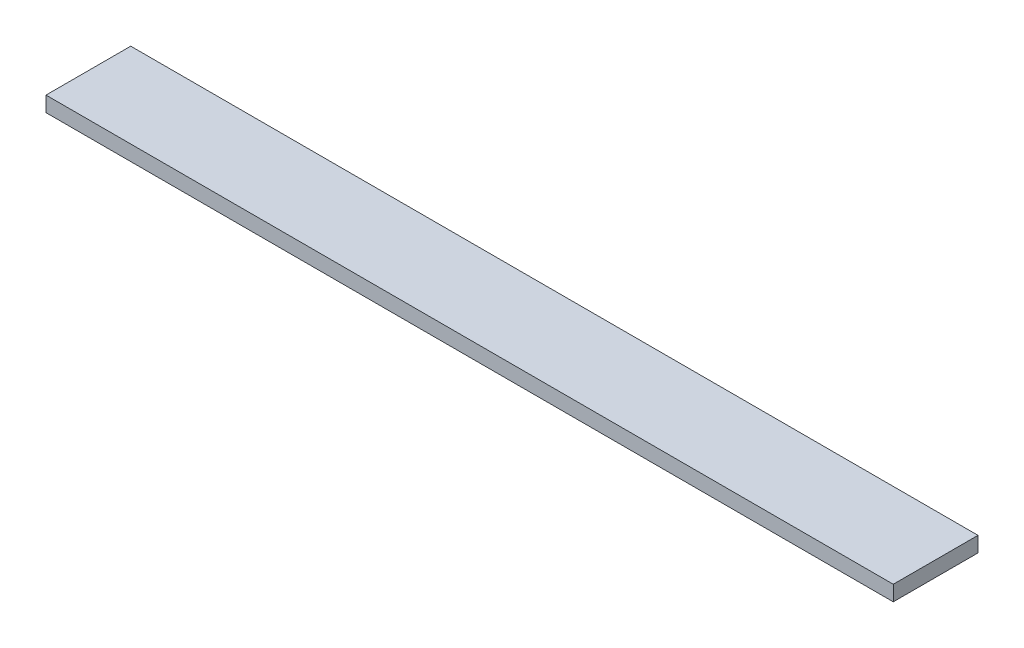
ISO-10303-21;
HEADER;
FILE_DESCRIPTION(('STEP AP214'),'2;1');
FILE_NAME('part.step','',(''),(''),'','','');
FILE_SCHEMA(('AUTOMOTIVE_DESIGN { 1 0 10303 214 1 1 1 1 }'));
ENDSEC;
DATA;
#1=APPLICATION_CONTEXT('core data for automotive mechanical design processes');
#2=APPLICATION_PROTOCOL_DEFINITION('international standard','automotive_design',2000,#1);
#3=PRODUCT_CONTEXT('',#1,'mechanical');
#4=PRODUCT('Part','Part','',(#3));
#5=PRODUCT_RELATED_PRODUCT_CATEGORY('part','',(#4));
#6=PRODUCT_DEFINITION_FORMATION('','',#4);
#7=PRODUCT_DEFINITION_CONTEXT('part definition',#1,'design');
#8=PRODUCT_DEFINITION('design','',#6,#7);
#9=PRODUCT_DEFINITION_SHAPE('','',#8);
#10=(LENGTH_UNIT() NAMED_UNIT(*) SI_UNIT(.MILLI.,.METRE.));
#11=(NAMED_UNIT(*) PLANE_ANGLE_UNIT() SI_UNIT($,.RADIAN.));
#12=(NAMED_UNIT(*) SI_UNIT($,.STERADIAN.) SOLID_ANGLE_UNIT());
#13=UNCERTAINTY_MEASURE_WITH_UNIT(LENGTH_MEASURE(1.E-05),#10,'distance_accuracy_value','');
#14=(GEOMETRIC_REPRESENTATION_CONTEXT(3) GLOBAL_UNCERTAINTY_ASSIGNED_CONTEXT((#13)) GLOBAL_UNIT_ASSIGNED_CONTEXT((#10,
#11,#12)) REPRESENTATION_CONTEXT('',''));
#15=CARTESIAN_POINT('',(0.,0.,0.));
#16=DIRECTION('',(0.,0.,1.));
#17=DIRECTION('',(1.,0.,0.));
#18=AXIS2_PLACEMENT_3D('',#15,#16,#17);
#19=CARTESIAN_POINT('',(500.,18.,-50.));
#20=DIRECTION('',(-1.,0.,0.));
#21=DIRECTION('',(0.,0.,1.));
#22=AXIS2_PLACEMENT_3D('',#19,#20,#21);
#23=PLANE('',#22);
#24=DIRECTION('',(0.,0.,-1.));
#25=VECTOR('',#24,1.);
#26=CARTESIAN_POINT('',(500.,0.,-50.));
#27=LINE('',#26,#25);
#28=CARTESIAN_POINT('',(500.,0.,50.));
#29=VERTEX_POINT('',#28);
#30=CARTESIAN_POINT('',(500.,0.,-50.));
#31=VERTEX_POINT('',#30);
#32=EDGE_CURVE('E96',#29,#31,#27,.T.);
#33=ORIENTED_EDGE('',*,*,#32,.T.);
#34=DIRECTION('',(0.,-1.,0.));
#35=VECTOR('',#34,1.);
#36=CARTESIAN_POINT('',(500.,18.,-50.));
#37=LINE('',#36,#35);
#38=CARTESIAN_POINT('',(500.,18.,-50.));
#39=VERTEX_POINT('',#38);
#40=EDGE_CURVE('E11',#39,#31,#37,.T.);
#41=ORIENTED_EDGE('',*,*,#40,.F.);
#42=DIRECTION('',(0.,0.,-1.));
#43=VECTOR('',#42,1.);
#44=CARTESIAN_POINT('',(500.,18.,-50.));
#45=LINE('',#44,#43);
#46=CARTESIAN_POINT('',(500.,18.,50.));
#47=VERTEX_POINT('',#46);
#48=EDGE_CURVE('E84',#47,#39,#45,.T.);
#49=ORIENTED_EDGE('',*,*,#48,.F.);
#50=DIRECTION('',(0.,-1.,0.));
#51=VECTOR('',#50,1.);
#52=CARTESIAN_POINT('',(500.,18.,50.));
#53=LINE('',#52,#51);
#54=EDGE_CURVE('E92',#47,#29,#53,.T.);
#55=ORIENTED_EDGE('',*,*,#54,.T.);
#56=EDGE_LOOP('',(#33,#41,#49,#55));
#57=FACE_BOUND('',#56,.T.);
#58=ADVANCED_FACE('F33',(#57),#23,.F.);
#59=CARTESIAN_POINT('',(-500.,18.,-50.));
#60=DIRECTION('',(0.,0.,1.));
#61=DIRECTION('',(1.,0.,0.));
#62=AXIS2_PLACEMENT_3D('',#59,#60,#61);
#63=PLANE('',#62);
#64=DIRECTION('',(-1.,0.,0.));
#65=VECTOR('',#64,1.);
#66=CARTESIAN_POINT('',(-500.,0.,-50.));
#67=LINE('',#66,#65);
#68=CARTESIAN_POINT('',(-500.,0.,-50.));
#69=VERTEX_POINT('',#68);
#70=EDGE_CURVE('E88',#31,#69,#67,.T.);
#71=ORIENTED_EDGE('',*,*,#70,.T.);
#72=DIRECTION('',(0.,-1.,0.));
#73=VECTOR('',#72,1.);
#74=CARTESIAN_POINT('',(-500.,18.,-50.));
#75=LINE('',#74,#73);
#76=CARTESIAN_POINT('',(-500.,18.,-50.));
#77=VERTEX_POINT('',#76);
#78=EDGE_CURVE('E41',#77,#69,#75,.T.);
#79=ORIENTED_EDGE('',*,*,#78,.F.);
#80=DIRECTION('',(-1.,0.,0.));
#81=VECTOR('',#80,1.);
#82=CARTESIAN_POINT('',(-500.,18.,-50.));
#83=LINE('',#82,#81);
#84=EDGE_CURVE('E79',#39,#77,#83,.T.);
#85=ORIENTED_EDGE('',*,*,#84,.F.);
#86=ORIENTED_EDGE('',*,*,#40,.T.);
#87=EDGE_LOOP('',(#71,#79,#85,#86));
#88=FACE_BOUND('',#87,.T.);
#89=ADVANCED_FACE('F87',(#88),#63,.F.);
#90=CARTESIAN_POINT('',(-500.,18.,-50.));
#91=DIRECTION('',(1.,0.,0.));
#92=DIRECTION('',(0.,0.,-1.));
#93=AXIS2_PLACEMENT_3D('',#90,#91,#92);
#94=PLANE('',#93);
#95=DIRECTION('',(0.,0.,1.));
#96=VECTOR('',#95,1.);
#97=CARTESIAN_POINT('',(-500.,0.,-50.));
#98=LINE('',#97,#96);
#99=CARTESIAN_POINT('',(-500.,0.,50.));
#100=VERTEX_POINT('',#99);
#101=EDGE_CURVE('E66',#69,#100,#98,.T.);
#102=ORIENTED_EDGE('',*,*,#101,.T.);
#103=DIRECTION('',(0.,-1.,0.));
#104=VECTOR('',#103,1.);
#105=CARTESIAN_POINT('',(-500.,18.,50.));
#106=LINE('',#105,#104);
#107=CARTESIAN_POINT('',(-500.,18.,50.));
#108=VERTEX_POINT('',#107);
#109=EDGE_CURVE('E89',#108,#100,#106,.T.);
#110=ORIENTED_EDGE('',*,*,#109,.F.);
#111=DIRECTION('',(0.,0.,1.));
#112=VECTOR('',#111,1.);
#113=CARTESIAN_POINT('',(-500.,18.,-50.));
#114=LINE('',#113,#112);
#115=EDGE_CURVE('E82',#77,#108,#114,.T.);
#116=ORIENTED_EDGE('',*,*,#115,.F.);
#117=ORIENTED_EDGE('',*,*,#78,.T.);
#118=EDGE_LOOP('',(#102,#110,#116,#117));
#119=FACE_BOUND('',#118,.T.);
#120=ADVANCED_FACE('F90',(#119),#94,.F.);
#121=CARTESIAN_POINT('',(-500.,18.,50.));
#122=DIRECTION('',(0.,0.,-1.));
#123=DIRECTION('',(-1.,0.,0.));
#124=AXIS2_PLACEMENT_3D('',#121,#122,#123);
#125=PLANE('',#124);
#126=DIRECTION('',(1.,0.,0.));
#127=VECTOR('',#126,1.);
#128=CARTESIAN_POINT('',(-500.,0.,50.));
#129=LINE('',#128,#127);
#130=EDGE_CURVE('E72',#100,#29,#129,.T.);
#131=ORIENTED_EDGE('',*,*,#130,.T.);
#132=ORIENTED_EDGE('',*,*,#54,.F.);
#133=DIRECTION('',(1.,0.,0.));
#134=VECTOR('',#133,1.);
#135=CARTESIAN_POINT('',(-500.,18.,50.));
#136=LINE('',#135,#134);
#137=EDGE_CURVE('E49',#108,#47,#136,.T.);
#138=ORIENTED_EDGE('',*,*,#137,.F.);
#139=ORIENTED_EDGE('',*,*,#109,.T.);
#140=EDGE_LOOP('',(#131,#132,#138,#139));
#141=FACE_BOUND('',#140,.T.);
#142=ADVANCED_FACE('F103',(#141),#125,.F.);
#143=CARTESIAN_POINT('',(0.,18.,0.));
#144=DIRECTION('',(0.,1.,0.));
#145=DIRECTION('',(0.,0.,1.));
#146=AXIS2_PLACEMENT_3D('',#143,#144,#145);
#147=PLANE('',#146);
#148=ORIENTED_EDGE('',*,*,#48,.T.);
#149=ORIENTED_EDGE('',*,*,#84,.T.);
#150=ORIENTED_EDGE('',*,*,#115,.T.);
#151=ORIENTED_EDGE('',*,*,#137,.T.);
#152=EDGE_LOOP('',(#148,#149,#150,#151));
#153=FACE_BOUND('',#152,.T.);
#154=ADVANCED_FACE('F80',(#153),#147,.T.);
#155=CARTESIAN_POINT('',(0.,0.,0.));
#156=DIRECTION('',(0.,1.,0.));
#157=DIRECTION('',(0.,0.,1.));
#158=AXIS2_PLACEMENT_3D('',#155,#156,#157);
#159=PLANE('',#158);
#160=ORIENTED_EDGE('',*,*,#32,.F.);
#161=ORIENTED_EDGE('',*,*,#130,.F.);
#162=ORIENTED_EDGE('',*,*,#101,.F.);
#163=ORIENTED_EDGE('',*,*,#70,.F.);
#164=EDGE_LOOP('',(#160,#161,#162,#163));
#165=FACE_BOUND('',#164,.T.);
#166=ADVANCED_FACE('F106',(#165),#159,.F.);
#167=CLOSED_SHELL('',(#58,#89,#120,#142,#154,#166));
#168=MANIFOLD_SOLID_BREP('B2',#167);
#169=ADVANCED_BREP_SHAPE_REPRESENTATION('',(#18,#168),#14);
#170=SHAPE_DEFINITION_REPRESENTATION(#9,#169);
ENDSEC;
END-ISO-10303-21;
